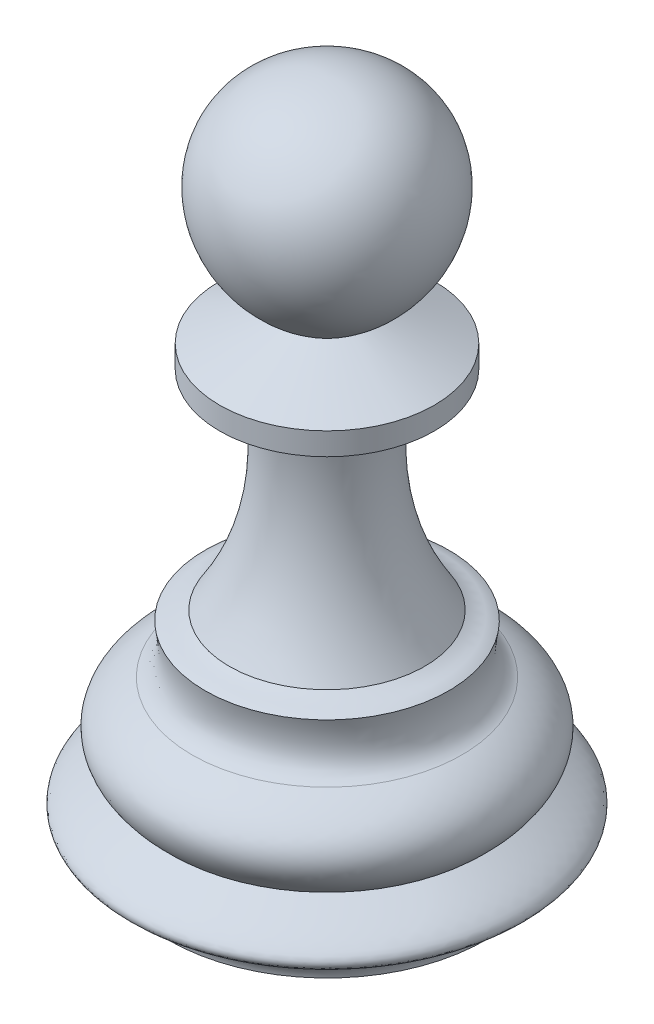
ISO-10303-21;
HEADER;
FILE_DESCRIPTION(('STEP AP214'),'2;1');
FILE_NAME('part.step','',(''),(''),'','','');
FILE_SCHEMA(('AUTOMOTIVE_DESIGN { 1 0 10303 214 1 1 1 1 }'));
ENDSEC;
DATA;
#1=APPLICATION_CONTEXT('core data for automotive mechanical design processes');
#2=APPLICATION_PROTOCOL_DEFINITION('international standard','automotive_design',2000,#1);
#3=PRODUCT_CONTEXT('',#1,'mechanical');
#4=PRODUCT('Part','Part','',(#3));
#5=PRODUCT_RELATED_PRODUCT_CATEGORY('part','',(#4));
#6=PRODUCT_DEFINITION_FORMATION('','',#4);
#7=PRODUCT_DEFINITION_CONTEXT('part definition',#1,'design');
#8=PRODUCT_DEFINITION('design','',#6,#7);
#9=PRODUCT_DEFINITION_SHAPE('','',#8);
#10=(LENGTH_UNIT() NAMED_UNIT(*) SI_UNIT(.MILLI.,.METRE.));
#11=(NAMED_UNIT(*) PLANE_ANGLE_UNIT() SI_UNIT($,.RADIAN.));
#12=(NAMED_UNIT(*) SI_UNIT($,.STERADIAN.) SOLID_ANGLE_UNIT());
#13=UNCERTAINTY_MEASURE_WITH_UNIT(LENGTH_MEASURE(1.E-05),#10,'distance_accuracy_value','');
#14=(GEOMETRIC_REPRESENTATION_CONTEXT(3) GLOBAL_UNCERTAINTY_ASSIGNED_CONTEXT((#13)) GLOBAL_UNIT_ASSIGNED_CONTEXT((#10,
#11,#12)) REPRESENTATION_CONTEXT('',''));
#15=CARTESIAN_POINT('',(0.,0.,0.));
#16=DIRECTION('',(0.,0.,1.));
#17=DIRECTION('',(1.,0.,0.));
#18=AXIS2_PLACEMENT_3D('',#15,#16,#17);
#19=CARTESIAN_POINT('',(0.,0.,0.));
#20=DIRECTION('',(0.,1.,0.));
#21=DIRECTION('',(0.,0.,1.));
#22=AXIS2_PLACEMENT_3D('',#19,#20,#21);
#23=PLANE('',#22);
#24=CARTESIAN_POINT('',(0.,0.,0.));
#25=DIRECTION('',(0.,1.,0.));
#26=DIRECTION('',(0.,0.,1.));
#27=AXIS2_PLACEMENT_3D('',#24,#25,#26);
#28=CIRCLE('',#27,60.0211422140179);
#29=CARTESIAN_POINT('',(0.,0.,60.0211422140179));
#30=VERTEX_POINT('',#29);
#31=EDGE_CURVE('E11',#30,#30,#28,.T.);
#32=ORIENTED_EDGE('',*,*,#31,.F.);
#33=EDGE_LOOP('',(#32));
#34=FACE_BOUND('',#33,.T.);
#35=ADVANCED_FACE('F32',(#34),#23,.F.);
#36=CARTESIAN_POINT('',(60.0211422140179,0.,0.));
#37=CARTESIAN_POINT('',(60.5791360687623,4.75721489993454,0.));
#38=CARTESIAN_POINT('',(64.1528205193095,7.13981662978724,0.));
#39=CARTESIAN_POINT('',(68.3101452382585,9.65428438698782,0.));
#40=B_SPLINE_CURVE_WITH_KNOTS('',3,(#36,#37,#38,#39),.UNSPECIFIED.,.F.,.F.,(4,4),(0.,1.),.UNSPECIFIED.);
#41=CARTESIAN_POINT('',(0.,253.313795933885,0.));
#42=DIRECTION('',(0.,1.,0.));
#43=AXIS1_PLACEMENT('',#41,#42);
#44=SURFACE_OF_REVOLUTION('',#40,#43);
#45=CARTESIAN_POINT('',(0.,9.65428438698782,0.));
#46=DIRECTION('',(0.,1.,0.));
#47=DIRECTION('',(0.,0.,1.));
#48=AXIS2_PLACEMENT_3D('',#45,#46,#47);
#49=CIRCLE('',#48,68.3101452382585);
#50=CARTESIAN_POINT('',(0.,9.65428438698782,68.3101452382585));
#51=VERTEX_POINT('',#50);
#52=EDGE_CURVE('E38',#51,#51,#49,.T.);
#53=ORIENTED_EDGE('',*,*,#52,.F.);
#54=EDGE_LOOP('',(#53));
#55=FACE_BOUND('',#54,.T.);
#56=ORIENTED_EDGE('',*,*,#31,.T.);
#57=EDGE_LOOP('',(#56));
#58=FACE_BOUND('',#57,.T.);
#59=ADVANCED_FACE('F82',(#55,#58),#44,.T.);
#60=CARTESIAN_POINT('',(68.3101452382585,9.65428438698782,0.));
#61=CARTESIAN_POINT('',(80.301120586042,14.4244754767616,0.));
#62=CARTESIAN_POINT('',(75.4925709544609,17.7521574675767,0.));
#63=CARTESIAN_POINT('',(58.3993807527535,26.9530733071421,0.));
#64=B_SPLINE_CURVE_WITH_KNOTS('',3,(#60,#61,#62,#63),.UNSPECIFIED.,.F.,.F.,(4,4),(0.,1.),.UNSPECIFIED.);
#65=CARTESIAN_POINT('',(0.,253.313795933885,0.));
#66=DIRECTION('',(0.,1.,0.));
#67=AXIS1_PLACEMENT('',#65,#66);
#68=SURFACE_OF_REVOLUTION('',#64,#67);
#69=CARTESIAN_POINT('',(0.,26.9530733071421,0.));
#70=DIRECTION('',(0.,1.,0.));
#71=DIRECTION('',(0.,0.,1.));
#72=AXIS2_PLACEMENT_3D('',#69,#70,#71);
#73=CIRCLE('',#72,58.3993807527535);
#74=CARTESIAN_POINT('',(0.,26.9530733071421,58.3993807527535));
#75=VERTEX_POINT('',#74);
#76=EDGE_CURVE('E75',#75,#75,#73,.T.);
#77=ORIENTED_EDGE('',*,*,#76,.F.);
#78=EDGE_LOOP('',(#77));
#79=FACE_BOUND('',#78,.T.);
#80=ORIENTED_EDGE('',*,*,#52,.T.);
#81=EDGE_LOOP('',(#80));
#82=FACE_BOUND('',#81,.T.);
#83=ADVANCED_FACE('F80',(#79,#82),#68,.T.);
#84=CARTESIAN_POINT('',(58.3993807527535,26.953073307142,0.));
#85=CARTESIAN_POINT('',(71.136373330714,38.2786533367225,0.));
#86=CARTESIAN_POINT('',(66.7598087867635,49.0937099347094,0.));
#87=CARTESIAN_POINT('',(51.0245546863301,56.1745742799044,0.));
#88=B_SPLINE_CURVE_WITH_KNOTS('',3,(#84,#85,#86,#87),.UNSPECIFIED.,.F.,.F.,(4,4),(0.,1.),.UNSPECIFIED.);
#89=CARTESIAN_POINT('',(0.,253.313795933885,0.));
#90=DIRECTION('',(0.,1.,0.));
#91=AXIS1_PLACEMENT('',#89,#90);
#92=SURFACE_OF_REVOLUTION('',#88,#91);
#93=CARTESIAN_POINT('',(0.,56.1745742799044,0.));
#94=DIRECTION('',(0.,1.,0.));
#95=DIRECTION('',(0.,0.,1.));
#96=AXIS2_PLACEMENT_3D('',#93,#94,#95);
#97=CIRCLE('',#96,51.0245546863301);
#98=CARTESIAN_POINT('',(0.,56.1745742799044,51.0245546863301));
#99=VERTEX_POINT('',#98);
#100=EDGE_CURVE('E72',#99,#99,#97,.T.);
#101=ORIENTED_EDGE('',*,*,#100,.F.);
#102=EDGE_LOOP('',(#101));
#103=FACE_BOUND('',#102,.T.);
#104=ORIENTED_EDGE('',*,*,#76,.T.);
#105=EDGE_LOOP('',(#104));
#106=FACE_BOUND('',#105,.T.);
#107=ADVANCED_FACE('F100',(#103,#106),#92,.T.);
#108=CARTESIAN_POINT('',(51.0245546863301,56.1745742799044,0.));
#109=CARTESIAN_POINT('',(42.8373501095244,60.0696812743871,0.));
#110=CARTESIAN_POINT('',(46.1128368777304,74.7550586963575,0.));
#111=B_SPLINE_CURVE_WITH_KNOTS('',2,(#108,#109,#110),.UNSPECIFIED.,.F.,.F.,(3,3),(0.,1.),.UNSPECIFIED.);
#112=CARTESIAN_POINT('',(0.,253.313795933885,0.));
#113=DIRECTION('',(0.,1.,0.));
#114=AXIS1_PLACEMENT('',#112,#113);
#115=SURFACE_OF_REVOLUTION('',#111,#114);
#116=CARTESIAN_POINT('',(0.,74.7550586963575,0.));
#117=DIRECTION('',(0.,1.,0.));
#118=DIRECTION('',(0.,0.,1.));
#119=AXIS2_PLACEMENT_3D('',#116,#117,#118);
#120=CIRCLE('',#119,46.1128368777304);
#121=CARTESIAN_POINT('',(0.,74.7550586963575,46.1128368777304));
#122=VERTEX_POINT('',#121);
#123=EDGE_CURVE('E69',#122,#122,#120,.T.);
#124=ORIENTED_EDGE('',*,*,#123,.F.);
#125=EDGE_LOOP('',(#124));
#126=FACE_BOUND('',#125,.T.);
#127=ORIENTED_EDGE('',*,*,#100,.T.);
#128=EDGE_LOOP('',(#127));
#129=FACE_BOUND('',#128,.T.);
#130=ADVANCED_FACE('F108',(#126,#129),#115,.T.);
#131=CARTESIAN_POINT('',(46.1128368777304,74.7550586963575,0.));
#132=CARTESIAN_POINT('',(42.6472197909455,76.5270873595078,0.));
#133=CARTESIAN_POINT('',(41.3330125944607,75.9393353521915,0.));
#134=CARTESIAN_POINT('',(36.986136885298,78.1899331563111,0.));
#135=B_SPLINE_CURVE_WITH_KNOTS('',3,(#131,#132,#133,#134),.UNSPECIFIED.,.F.,.F.,(4,4),(0.,1.),.UNSPECIFIED.);
#136=CARTESIAN_POINT('',(0.,253.313795933885,0.));
#137=DIRECTION('',(0.,1.,0.));
#138=AXIS1_PLACEMENT('',#136,#137);
#139=SURFACE_OF_REVOLUTION('',#135,#138);
#140=CARTESIAN_POINT('',(0.,78.1899331563111,0.));
#141=DIRECTION('',(0.,1.,0.));
#142=DIRECTION('',(0.,0.,1.));
#143=AXIS2_PLACEMENT_3D('',#140,#141,#142);
#144=CIRCLE('',#143,36.986136885298);
#145=CARTESIAN_POINT('',(0.,78.1899331563111,36.986136885298));
#146=VERTEX_POINT('',#145);
#147=EDGE_CURVE('E66',#146,#146,#144,.T.);
#148=ORIENTED_EDGE('',*,*,#147,.F.);
#149=EDGE_LOOP('',(#148));
#150=FACE_BOUND('',#149,.T.);
#151=ORIENTED_EDGE('',*,*,#123,.T.);
#152=EDGE_LOOP('',(#151));
#153=FACE_BOUND('',#152,.T.);
#154=ADVANCED_FACE('F116',(#150,#153),#139,.T.);
#155=CARTESIAN_POINT('',(36.986136885298,78.1899331563111,0.));
#156=CARTESIAN_POINT('',(14.7657766605722,112.53547789813,0.));
#157=CARTESIAN_POINT('',(23.6157958714871,157.108898701361,0.));
#158=B_SPLINE_CURVE_WITH_KNOTS('',2,(#155,#156,#157),.UNSPECIFIED.,.F.,.F.,(3,3),(0.,1.),.UNSPECIFIED.);
#159=CARTESIAN_POINT('',(0.,253.313795933885,0.));
#160=DIRECTION('',(0.,1.,0.));
#161=AXIS1_PLACEMENT('',#159,#160);
#162=SURFACE_OF_REVOLUTION('',#158,#161);
#163=CARTESIAN_POINT('',(0.,157.108898701361,0.));
#164=DIRECTION('',(0.,1.,0.));
#165=DIRECTION('',(0.,0.,1.));
#166=AXIS2_PLACEMENT_3D('',#163,#164,#165);
#167=CIRCLE('',#166,23.6157958714871);
#168=CARTESIAN_POINT('',(0.,157.108898701361,23.6157958714871));
#169=VERTEX_POINT('',#168);
#170=EDGE_CURVE('E63',#169,#169,#167,.T.);
#171=ORIENTED_EDGE('',*,*,#170,.F.);
#172=EDGE_LOOP('',(#171));
#173=FACE_BOUND('',#172,.T.);
#174=ORIENTED_EDGE('',*,*,#147,.T.);
#175=EDGE_LOOP('',(#174));
#176=FACE_BOUND('',#175,.T.);
#177=ADVANCED_FACE('F124',(#173,#176),#162,.T.);
#178=CARTESIAN_POINT('',(23.6157958714871,157.108898701361,0.));
#179=DIRECTION('',(0.,1.,0.));
#180=DIRECTION('',(0.,0.,1.));
#181=AXIS2_PLACEMENT_3D('',#178,#179,#180);
#182=PLANE('',#181);
#183=CARTESIAN_POINT('',(0.,157.108898701361,0.));
#184=DIRECTION('',(0.,1.,0.));
#185=DIRECTION('',(0.,0.,1.));
#186=AXIS2_PLACEMENT_3D('',#183,#184,#185);
#187=CIRCLE('',#186,40.6209342858142);
#188=CARTESIAN_POINT('',(0.,157.108898701361,40.6209342858142));
#189=VERTEX_POINT('',#188);
#190=EDGE_CURVE('E53',#189,#189,#187,.T.);
#191=ORIENTED_EDGE('',*,*,#190,.F.);
#192=EDGE_LOOP('',(#191));
#193=FACE_BOUND('',#192,.T.);
#194=ORIENTED_EDGE('',*,*,#170,.T.);
#195=EDGE_LOOP('',(#194));
#196=FACE_BOUND('',#195,.T.);
#197=ADVANCED_FACE('F132',(#193,#196),#182,.F.);
#198=CARTESIAN_POINT('',(0.,253.313795933885,0.));
#199=DIRECTION('',(0.,1.,0.));
#200=DIRECTION('',(0.,0.,1.));
#201=AXIS2_PLACEMENT_3D('',#198,#199,#200);
#202=CYLINDRICAL_SURFACE('',#201,40.6209342858142);
#203=CARTESIAN_POINT('',(0.,165.590711160662,0.));
#204=DIRECTION('',(0.,1.,0.));
#205=DIRECTION('',(0.,0.,1.));
#206=AXIS2_PLACEMENT_3D('',#203,#204,#205);
#207=CIRCLE('',#206,40.6209342858142);
#208=CARTESIAN_POINT('',(0.,165.590711160662,40.6209342858142));
#209=VERTEX_POINT('',#208);
#210=EDGE_CURVE('E50',#209,#209,#207,.T.);
#211=ORIENTED_EDGE('',*,*,#210,.F.);
#212=EDGE_LOOP('',(#211));
#213=FACE_BOUND('',#212,.T.);
#214=ORIENTED_EDGE('',*,*,#190,.T.);
#215=EDGE_LOOP('',(#214));
#216=FACE_BOUND('',#215,.T.);
#217=ADVANCED_FACE('F140',(#213,#216),#202,.T.);
#218=CARTESIAN_POINT('',(0.,165.590711160662,0.));
#219=DIRECTION('',(0.,-1.,0.));
#220=DIRECTION('',(0.,0.,-1.));
#221=AXIS2_PLACEMENT_3D('',#218,#219,#220);
#222=CONICAL_SURFACE('',#221,40.6209342858142,1.16364380585339);
#223=CARTESIAN_POINT('',(0.,177.179722243668,0.));
#224=DIRECTION('',(0.,1.,0.));
#225=DIRECTION('',(0.,0.,1.));
#226=AXIS2_PLACEMENT_3D('',#223,#224,#225);
#227=CIRCLE('',#226,13.7478651078298);
#228=CARTESIAN_POINT('',(0.,177.179722243668,13.7478651078298));
#229=VERTEX_POINT('',#228);
#230=EDGE_CURVE('E48',#229,#229,#227,.T.);
#231=ORIENTED_EDGE('',*,*,#230,.F.);
#232=EDGE_LOOP('',(#231));
#233=FACE_BOUND('',#232,.T.);
#234=ORIENTED_EDGE('',*,*,#210,.T.);
#235=EDGE_LOOP('',(#234));
#236=FACE_BOUND('',#235,.T.);
#237=ADVANCED_FACE('F44',(#233,#236),#222,.T.);
#238=CARTESIAN_POINT('',(13.7478651078298,177.179722243668,0.));
#239=CARTESIAN_POINT('',(53.7372989455638,200.684816458993,0.));
#240=CARTESIAN_POINT('',(43.5942762436207,252.494744754025,0.));
#241=CARTESIAN_POINT('',(-1.16158486146089E-13,253.313795933885,0.));
#242=B_SPLINE_CURVE_WITH_KNOTS('',3,(#238,#239,#240,#241),.UNSPECIFIED.,.F.,.F.,(4,4),(0.,1.),.UNSPECIFIED.);
#243=CARTESIAN_POINT('',(0.,253.313795933885,0.));
#244=DIRECTION('',(0.,1.,0.));
#245=AXIS1_PLACEMENT('',#243,#244);
#246=SURFACE_OF_REVOLUTION('',#242,#245);
#247=CARTESIAN_POINT('',(-1.16158486146089E-13,253.313795933885,0.));
#248=VERTEX_POINT('',#247);
#249=VERTEX_LOOP('',#248);
#250=FACE_BOUND('',#249,.T.);
#251=ORIENTED_EDGE('',*,*,#230,.T.);
#252=EDGE_LOOP('',(#251));
#253=FACE_BOUND('',#252,.T.);
#254=ADVANCED_FACE('F41',(#250,#253),#246,.T.);
#255=CLOSED_SHELL('',(#35,#59,#83,#107,#130,#154,#177,#197,#217,#237,#254));
#256=MANIFOLD_SOLID_BREP('B2',#255);
#257=ADVANCED_BREP_SHAPE_REPRESENTATION('',(#18,#256),#14);
#258=SHAPE_DEFINITION_REPRESENTATION(#9,#257);
ENDSEC;
END-ISO-10303-21;
